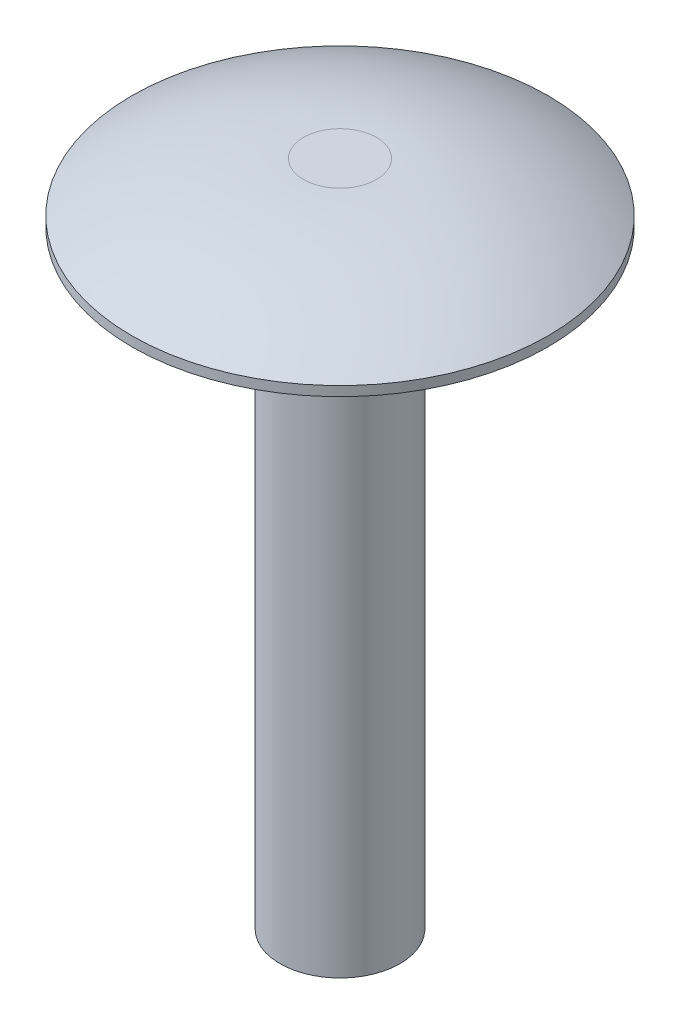
ISO-10303-21;
HEADER;
FILE_DESCRIPTION(('STEP AP214'),'2;1');
FILE_NAME('part.step','',(''),(''),'','','');
FILE_SCHEMA(('AUTOMOTIVE_DESIGN { 1 0 10303 214 1 1 1 1 }'));
ENDSEC;
DATA;
#1=APPLICATION_CONTEXT('core data for automotive mechanical design processes');
#2=APPLICATION_PROTOCOL_DEFINITION('international standard','automotive_design',2000,#1);
#3=PRODUCT_CONTEXT('',#1,'mechanical');
#4=PRODUCT('Part','Part','',(#3));
#5=PRODUCT_RELATED_PRODUCT_CATEGORY('part','',(#4));
#6=PRODUCT_DEFINITION_FORMATION('','',#4);
#7=PRODUCT_DEFINITION_CONTEXT('part definition',#1,'design');
#8=PRODUCT_DEFINITION('design','',#6,#7);
#9=PRODUCT_DEFINITION_SHAPE('','',#8);
#10=(LENGTH_UNIT() NAMED_UNIT(*) SI_UNIT(.MILLI.,.METRE.));
#11=(NAMED_UNIT(*) PLANE_ANGLE_UNIT() SI_UNIT($,.RADIAN.));
#12=(NAMED_UNIT(*) SI_UNIT($,.STERADIAN.) SOLID_ANGLE_UNIT());
#13=UNCERTAINTY_MEASURE_WITH_UNIT(LENGTH_MEASURE(1.E-05),#10,'distance_accuracy_value','');
#14=(GEOMETRIC_REPRESENTATION_CONTEXT(3) GLOBAL_UNCERTAINTY_ASSIGNED_CONTEXT((#13)) GLOBAL_UNIT_ASSIGNED_CONTEXT((#10,
#11,#12)) REPRESENTATION_CONTEXT('',''));
#15=CARTESIAN_POINT('',(0.,0.,0.));
#16=DIRECTION('',(0.,0.,1.));
#17=DIRECTION('',(1.,0.,0.));
#18=AXIS2_PLACEMENT_3D('',#15,#16,#17);
#19=CARTESIAN_POINT('',(0.,0.,0.));
#20=DIRECTION('',(0.,1.,0.));
#21=DIRECTION('',(-1.,0.,0.));
#22=AXIS2_PLACEMENT_3D('',#19,#20,#21);
#23=PLANE('',#22);
#24=CARTESIAN_POINT('',(0.,0.,0.));
#25=DIRECTION('',(0.,-1.,0.));
#26=DIRECTION('',(1.,0.,0.));
#27=AXIS2_PLACEMENT_3D('',#24,#25,#26);
#28=CIRCLE('',#27,2.38125);
#29=CARTESIAN_POINT('',(2.38125,0.,0.));
#30=VERTEX_POINT('',#29);
#31=EDGE_CURVE('E10',#30,#30,#28,.T.);
#32=ORIENTED_EDGE('',*,*,#31,.T.);
#33=EDGE_LOOP('',(#32));
#34=FACE_BOUND('',#33,.T.);
#35=ADVANCED_FACE('F39',(#34),#23,.F.);
#36=CARTESIAN_POINT('',(0.,0.,0.));
#37=DIRECTION('',(0.,-1.,0.));
#38=DIRECTION('',(1.,0.,0.));
#39=AXIS2_PLACEMENT_3D('',#36,#37,#38);
#40=CYLINDRICAL_SURFACE('',#39,2.38125);
#41=ORIENTED_EDGE('',*,*,#31,.F.);
#42=EDGE_LOOP('',(#41));
#43=FACE_BOUND('',#42,.T.);
#44=CARTESIAN_POINT('',(0.,24.13,0.));
#45=DIRECTION('',(0.,-1.,0.));
#46=DIRECTION('',(1.,0.,0.));
#47=AXIS2_PLACEMENT_3D('',#44,#45,#46);
#48=CIRCLE('',#47,2.38125);
#49=CARTESIAN_POINT('',(2.38125,24.13,0.));
#50=VERTEX_POINT('',#49);
#51=EDGE_CURVE('E45',#50,#50,#48,.T.);
#52=ORIENTED_EDGE('',*,*,#51,.T.);
#53=EDGE_LOOP('',(#52));
#54=FACE_BOUND('',#53,.T.);
#55=ADVANCED_FACE('F74',(#43,#54),#40,.T.);
#56=CARTESIAN_POINT('',(-2.38125,24.13,0.));
#57=DIRECTION('',(0.,1.,0.));
#58=DIRECTION('',(-1.,0.,0.));
#59=AXIS2_PLACEMENT_3D('',#56,#57,#58);
#60=PLANE('',#59);
#61=ORIENTED_EDGE('',*,*,#51,.F.);
#62=EDGE_LOOP('',(#61));
#63=FACE_BOUND('',#62,.T.);
#64=CARTESIAN_POINT('',(0.,24.13,0.));
#65=DIRECTION('',(0.,-1.,0.));
#66=DIRECTION('',(1.,0.,0.));
#67=AXIS2_PLACEMENT_3D('',#64,#65,#66);
#68=CIRCLE('',#67,8.255);
#69=CARTESIAN_POINT('',(8.255,24.13,0.));
#70=VERTEX_POINT('',#69);
#71=EDGE_CURVE('E49',#70,#70,#68,.T.);
#72=ORIENTED_EDGE('',*,*,#71,.T.);
#73=EDGE_LOOP('',(#72));
#74=FACE_BOUND('',#73,.T.);
#75=ADVANCED_FACE('F78',(#63,#74),#60,.F.);
#76=CARTESIAN_POINT('',(0.,0.,0.));
#77=DIRECTION('',(0.,-1.,0.));
#78=DIRECTION('',(1.,0.,0.));
#79=AXIS2_PLACEMENT_3D('',#76,#77,#78);
#80=CYLINDRICAL_SURFACE('',#79,8.255);
#81=ORIENTED_EDGE('',*,*,#71,.F.);
#82=EDGE_LOOP('',(#81));
#83=FACE_BOUND('',#82,.T.);
#84=CARTESIAN_POINT('',(0.,24.511,0.));
#85=DIRECTION('',(0.,-1.,0.));
#86=DIRECTION('',(1.,0.,0.));
#87=AXIS2_PLACEMENT_3D('',#84,#85,#86);
#88=CIRCLE('',#87,8.255);
#89=CARTESIAN_POINT('',(8.255,24.511,0.));
#90=VERTEX_POINT('',#89);
#91=EDGE_CURVE('E53',#90,#90,#88,.T.);
#92=ORIENTED_EDGE('',*,*,#91,.T.);
#93=EDGE_LOOP('',(#92));
#94=FACE_BOUND('',#93,.T.);
#95=ADVANCED_FACE('F70',(#83,#94),#80,.T.);
#96=CARTESIAN_POINT('',(0.,13.7253816129032,0.));
#97=DIRECTION('',(0.,-1.,0.));
#98=DIRECTION('',(1.,0.,0.));
#99=AXIS2_PLACEMENT_3D('',#96,#97,#98);
#100=DEGENERATE_TOROIDAL_SURFACE('',#99,1.4478,12.7541183870968,.T.);
#101=ORIENTED_EDGE('',*,*,#91,.F.);
#102=EDGE_LOOP('',(#101));
#103=FACE_BOUND('',#102,.T.);
#104=CARTESIAN_POINT('',(0.,26.4795,0.));
#105=DIRECTION('',(0.,-1.,0.));
#106=DIRECTION('',(1.,0.,0.));
#107=AXIS2_PLACEMENT_3D('',#104,#105,#106);
#108=CIRCLE('',#107,1.4478);
#109=CARTESIAN_POINT('',(1.4478,26.4795,0.));
#110=VERTEX_POINT('',#109);
#111=EDGE_CURVE('E58',#110,#110,#108,.T.);
#112=ORIENTED_EDGE('',*,*,#111,.T.);
#113=EDGE_LOOP('',(#112));
#114=FACE_BOUND('',#113,.T.);
#115=ADVANCED_FACE('F62',(#103,#114),#100,.T.);
#116=CARTESIAN_POINT('',(-1.4478,26.4795,0.));
#117=DIRECTION('',(0.,-1.,0.));
#118=DIRECTION('',(1.,0.,0.));
#119=AXIS2_PLACEMENT_3D('',#116,#117,#118);
#120=PLANE('',#119);
#121=ORIENTED_EDGE('',*,*,#111,.F.);
#122=EDGE_LOOP('',(#121));
#123=FACE_BOUND('',#122,.T.);
#124=ADVANCED_FACE('F64',(#123),#120,.F.);
#125=CLOSED_SHELL('',(#35,#55,#75,#95,#115,#124));
#126=MANIFOLD_SOLID_BREP('B2',#125);
#127=ADVANCED_BREP_SHAPE_REPRESENTATION('',(#18,#126),#14);
#128=SHAPE_DEFINITION_REPRESENTATION(#9,#127);
ENDSEC;
END-ISO-10303-21;
